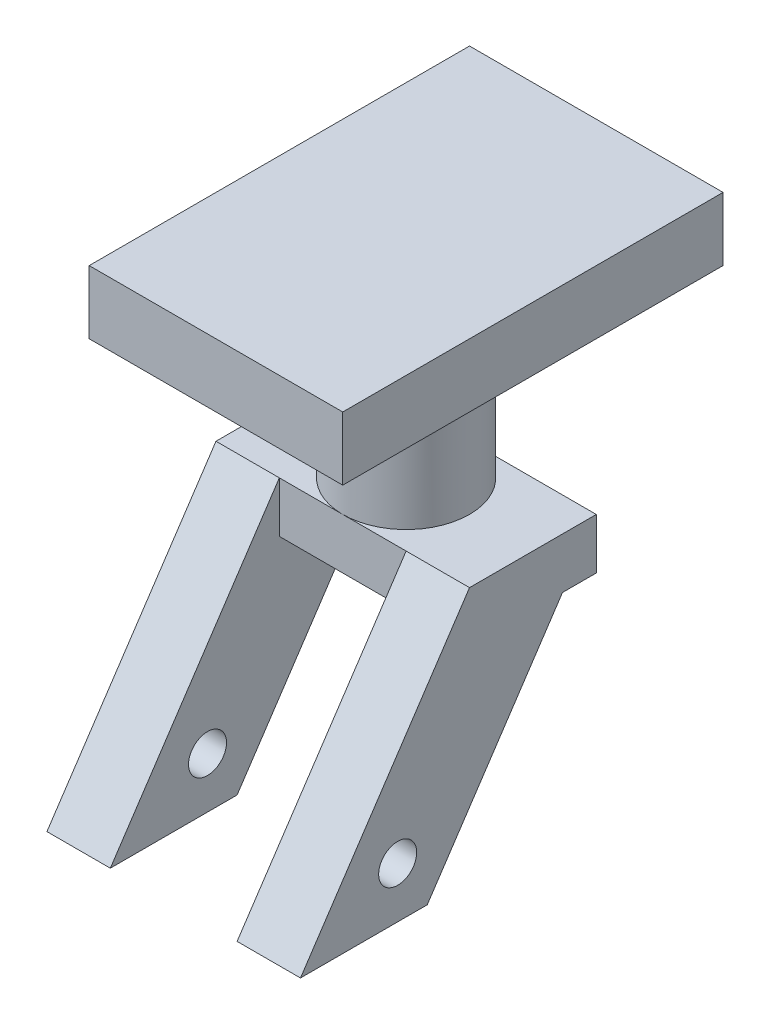
ISO-10303-21;
HEADER;
FILE_DESCRIPTION(('STEP AP214'),'2;1');
FILE_NAME('part.step','',(''),(''),'','','');
FILE_SCHEMA(('AUTOMOTIVE_DESIGN { 1 0 10303 214 1 1 1 1 }'));
ENDSEC;
DATA;
#1=APPLICATION_CONTEXT('core data for automotive mechanical design processes');
#2=APPLICATION_PROTOCOL_DEFINITION('international standard','automotive_design',2000,#1);
#3=PRODUCT_CONTEXT('',#1,'mechanical');
#4=PRODUCT('Part','Part','',(#3));
#5=PRODUCT_RELATED_PRODUCT_CATEGORY('part','',(#4));
#6=PRODUCT_DEFINITION_FORMATION('','',#4);
#7=PRODUCT_DEFINITION_CONTEXT('part definition',#1,'design');
#8=PRODUCT_DEFINITION('design','',#6,#7);
#9=PRODUCT_DEFINITION_SHAPE('','',#8);
#10=(LENGTH_UNIT() NAMED_UNIT(*) SI_UNIT(.MILLI.,.METRE.));
#11=(NAMED_UNIT(*) PLANE_ANGLE_UNIT() SI_UNIT($,.RADIAN.));
#12=(NAMED_UNIT(*) SI_UNIT($,.STERADIAN.) SOLID_ANGLE_UNIT());
#13=UNCERTAINTY_MEASURE_WITH_UNIT(LENGTH_MEASURE(1.E-05),#10,'distance_accuracy_value','');
#14=(GEOMETRIC_REPRESENTATION_CONTEXT(3) GLOBAL_UNCERTAINTY_ASSIGNED_CONTEXT((#13)) GLOBAL_UNIT_ASSIGNED_CONTEXT((#10,
#11,#12)) REPRESENTATION_CONTEXT('',''));
#15=CARTESIAN_POINT('',(0.,0.,0.));
#16=DIRECTION('',(0.,0.,1.));
#17=DIRECTION('',(1.,0.,0.));
#18=AXIS2_PLACEMENT_3D('',#15,#16,#17);
#19=CARTESIAN_POINT('',(-5.,-8.,2.5));
#20=DIRECTION('',(0.,0.,-1.));
#21=DIRECTION('',(-1.,0.,0.));
#22=AXIS2_PLACEMENT_3D('',#19,#20,#21);
#23=PLANE('',#22);
#24=DIRECTION('',(0.,-1.,0.));
#25=VECTOR('',#24,1.);
#26=CARTESIAN_POINT('',(2.5,-8.,2.5));
#27=LINE('',#26,#25);
#28=CARTESIAN_POINT('',(2.5,-6.,2.5));
#29=VERTEX_POINT('',#28);
#30=CARTESIAN_POINT('',(2.5,-8.,2.5));
#31=VERTEX_POINT('',#30);
#32=EDGE_CURVE('E60',#29,#31,#27,.T.);
#33=ORIENTED_EDGE('',*,*,#32,.F.);
#34=DIRECTION('',(-1.,0.,0.));
#35=VECTOR('',#34,1.);
#36=CARTESIAN_POINT('',(-5.,-6.,2.5));
#37=LINE('',#36,#35);
#38=CARTESIAN_POINT('',(0.,-6.,2.5));
#39=VERTEX_POINT('',#38);
#40=EDGE_CURVE('E260',#29,#39,#37,.T.);
#41=ORIENTED_EDGE('',*,*,#40,.T.);
#42=CARTESIAN_POINT('',(-2.5,-6.,2.5));
#43=VERTEX_POINT('',#42);
#44=EDGE_CURVE('E256',#39,#43,#37,.T.);
#45=ORIENTED_EDGE('',*,*,#44,.T.);
#46=DIRECTION('',(0.,1.,0.));
#47=VECTOR('',#46,1.);
#48=CARTESIAN_POINT('',(-2.5,-8.,2.5));
#49=LINE('',#48,#47);
#50=CARTESIAN_POINT('',(-2.5,-8.,2.5));
#51=VERTEX_POINT('',#50);
#52=EDGE_CURVE('E228',#51,#43,#49,.T.);
#53=ORIENTED_EDGE('',*,*,#52,.F.);
#54=DIRECTION('',(-1.,0.,0.));
#55=VECTOR('',#54,1.);
#56=CARTESIAN_POINT('',(-5.,-8.,2.5));
#57=LINE('',#56,#55);
#58=EDGE_CURVE('E242',#31,#51,#57,.T.);
#59=ORIENTED_EDGE('',*,*,#58,.F.);
#60=EDGE_LOOP('',(#33,#41,#45,#53,#59));
#61=FACE_BOUND('',#60,.T.);
#62=ADVANCED_FACE('F43',(#61),#23,.F.);
#63=CARTESIAN_POINT('',(5.,2.5,-7.5));
#64=DIRECTION('',(-1.,0.,0.));
#65=DIRECTION('',(0.,0.,1.));
#66=AXIS2_PLACEMENT_3D('',#63,#64,#65);
#67=PLANE('',#66);
#68=DIRECTION('',(0.,0.,-1.));
#69=VECTOR('',#68,1.);
#70=CARTESIAN_POINT('',(5.,0.,-7.5));
#71=LINE('',#70,#69);
#72=CARTESIAN_POINT('',(5.,0.,7.5));
#73=VERTEX_POINT('',#72);
#74=CARTESIAN_POINT('',(5.,0.,-7.5));
#75=VERTEX_POINT('',#74);
#76=EDGE_CURVE('E278',#73,#75,#71,.T.);
#77=ORIENTED_EDGE('',*,*,#76,.T.);
#78=DIRECTION('',(0.,-1.,0.));
#79=VECTOR('',#78,1.);
#80=CARTESIAN_POINT('',(5.,2.5,-7.5));
#81=LINE('',#80,#79);
#82=CARTESIAN_POINT('',(5.,2.5,-7.5));
#83=VERTEX_POINT('',#82);
#84=EDGE_CURVE('E284',#83,#75,#81,.T.);
#85=ORIENTED_EDGE('',*,*,#84,.F.);
#86=DIRECTION('',(0.,0.,-1.));
#87=VECTOR('',#86,1.);
#88=CARTESIAN_POINT('',(5.,2.5,-7.5));
#89=LINE('',#88,#87);
#90=CARTESIAN_POINT('',(5.,2.5,7.5));
#91=VERTEX_POINT('',#90);
#92=EDGE_CURVE('E285',#91,#83,#89,.T.);
#93=ORIENTED_EDGE('',*,*,#92,.F.);
#94=DIRECTION('',(0.,-1.,0.));
#95=VECTOR('',#94,1.);
#96=CARTESIAN_POINT('',(5.,2.5,7.5));
#97=LINE('',#96,#95);
#98=EDGE_CURVE('E299',#91,#73,#97,.T.);
#99=ORIENTED_EDGE('',*,*,#98,.T.);
#100=EDGE_LOOP('',(#77,#85,#93,#99));
#101=FACE_BOUND('',#100,.T.);
#102=ADVANCED_FACE('F45',(#101),#67,.F.);
#103=CARTESIAN_POINT('',(-5.,2.5,-7.5));
#104=DIRECTION('',(0.,0.,1.));
#105=DIRECTION('',(1.,0.,0.));
#106=AXIS2_PLACEMENT_3D('',#103,#104,#105);
#107=PLANE('',#106);
#108=DIRECTION('',(-1.,0.,0.));
#109=VECTOR('',#108,1.);
#110=CARTESIAN_POINT('',(-5.,0.,-7.5));
#111=LINE('',#110,#109);
#112=CARTESIAN_POINT('',(-5.,0.,-7.5));
#113=VERTEX_POINT('',#112);
#114=EDGE_CURVE('E303',#75,#113,#111,.T.);
#115=ORIENTED_EDGE('',*,*,#114,.T.);
#116=DIRECTION('',(0.,-1.,0.));
#117=VECTOR('',#116,1.);
#118=CARTESIAN_POINT('',(-5.,2.5,-7.5));
#119=LINE('',#118,#117);
#120=CARTESIAN_POINT('',(-5.,2.5,-7.5));
#121=VERTEX_POINT('',#120);
#122=EDGE_CURVE('E318',#121,#113,#119,.T.);
#123=ORIENTED_EDGE('',*,*,#122,.F.);
#124=DIRECTION('',(-1.,0.,0.));
#125=VECTOR('',#124,1.);
#126=CARTESIAN_POINT('',(-5.,2.5,-7.5));
#127=LINE('',#126,#125);
#128=EDGE_CURVE('E289',#83,#121,#127,.T.);
#129=ORIENTED_EDGE('',*,*,#128,.F.);
#130=ORIENTED_EDGE('',*,*,#84,.T.);
#131=EDGE_LOOP('',(#115,#123,#129,#130));
#132=FACE_BOUND('',#131,.T.);
#133=ADVANCED_FACE('F399',(#132),#107,.F.);
#134=CARTESIAN_POINT('',(-5.,2.5,-7.5));
#135=DIRECTION('',(1.,0.,0.));
#136=DIRECTION('',(0.,0.,-1.));
#137=AXIS2_PLACEMENT_3D('',#134,#135,#136);
#138=PLANE('',#137);
#139=DIRECTION('',(0.,0.,1.));
#140=VECTOR('',#139,1.);
#141=CARTESIAN_POINT('',(-5.,0.,-7.5));
#142=LINE('',#141,#140);
#143=CARTESIAN_POINT('',(-5.,0.,7.5));
#144=VERTEX_POINT('',#143);
#145=EDGE_CURVE('E306',#113,#144,#142,.T.);
#146=ORIENTED_EDGE('',*,*,#145,.T.);
#147=DIRECTION('',(0.,-1.,0.));
#148=VECTOR('',#147,1.);
#149=CARTESIAN_POINT('',(-5.,2.5,7.5));
#150=LINE('',#149,#148);
#151=CARTESIAN_POINT('',(-5.,2.5,7.5));
#152=VERTEX_POINT('',#151);
#153=EDGE_CURVE('E314',#152,#144,#150,.T.);
#154=ORIENTED_EDGE('',*,*,#153,.F.);
#155=DIRECTION('',(0.,0.,1.));
#156=VECTOR('',#155,1.);
#157=CARTESIAN_POINT('',(-5.,2.5,-7.5));
#158=LINE('',#157,#156);
#159=EDGE_CURVE('E293',#121,#152,#158,.T.);
#160=ORIENTED_EDGE('',*,*,#159,.F.);
#161=ORIENTED_EDGE('',*,*,#122,.T.);
#162=EDGE_LOOP('',(#146,#154,#160,#161));
#163=FACE_BOUND('',#162,.T.);
#164=ADVANCED_FACE('F423',(#163),#138,.F.);
#165=CARTESIAN_POINT('',(-5.,2.5,7.5));
#166=DIRECTION('',(0.,0.,-1.));
#167=DIRECTION('',(-1.,0.,0.));
#168=AXIS2_PLACEMENT_3D('',#165,#166,#167);
#169=PLANE('',#168);
#170=DIRECTION('',(1.,0.,0.));
#171=VECTOR('',#170,1.);
#172=CARTESIAN_POINT('',(-5.,0.,7.5));
#173=LINE('',#172,#171);
#174=EDGE_CURVE('E290',#144,#73,#173,.T.);
#175=ORIENTED_EDGE('',*,*,#174,.T.);
#176=ORIENTED_EDGE('',*,*,#98,.F.);
#177=DIRECTION('',(1.,0.,0.));
#178=VECTOR('',#177,1.);
#179=CARTESIAN_POINT('',(-5.,2.5,7.5));
#180=LINE('',#179,#178);
#181=EDGE_CURVE('E296',#152,#91,#180,.T.);
#182=ORIENTED_EDGE('',*,*,#181,.F.);
#183=ORIENTED_EDGE('',*,*,#153,.T.);
#184=EDGE_LOOP('',(#175,#176,#182,#183));
#185=FACE_BOUND('',#184,.T.);
#186=ADVANCED_FACE('F416',(#185),#169,.F.);
#187=CARTESIAN_POINT('',(0.,2.5,0.));
#188=DIRECTION('',(0.,1.,0.));
#189=DIRECTION('',(0.,0.,1.));
#190=AXIS2_PLACEMENT_3D('',#187,#188,#189);
#191=PLANE('',#190);
#192=ORIENTED_EDGE('',*,*,#92,.T.);
#193=ORIENTED_EDGE('',*,*,#128,.T.);
#194=ORIENTED_EDGE('',*,*,#159,.T.);
#195=ORIENTED_EDGE('',*,*,#181,.T.);
#196=EDGE_LOOP('',(#192,#193,#194,#195));
#197=FACE_BOUND('',#196,.T.);
#198=ADVANCED_FACE('F413',(#197),#191,.T.);
#199=CARTESIAN_POINT('',(0.,0.,0.));
#200=DIRECTION('',(0.,1.,0.));
#201=DIRECTION('',(0.,0.,1.));
#202=AXIS2_PLACEMENT_3D('',#199,#200,#201);
#203=PLANE('',#202);
#204=CARTESIAN_POINT('',(0.,0.,0.));
#205=DIRECTION('',(0.,-1.,0.));
#206=DIRECTION('',(0.,0.,-1.));
#207=AXIS2_PLACEMENT_3D('',#204,#205,#206);
#208=CIRCLE('',#207,2.5);
#209=CARTESIAN_POINT('',(0.,0.,-2.5));
#210=VERTEX_POINT('',#209);
#211=EDGE_CURVE('E279',#210,#210,#208,.T.);
#212=ORIENTED_EDGE('',*,*,#211,.F.);
#213=EDGE_LOOP('',(#212));
#214=FACE_BOUND('',#213,.T.);
#215=ORIENTED_EDGE('',*,*,#76,.F.);
#216=ORIENTED_EDGE('',*,*,#174,.F.);
#217=ORIENTED_EDGE('',*,*,#145,.F.);
#218=ORIENTED_EDGE('',*,*,#114,.F.);
#219=EDGE_LOOP('',(#215,#216,#217,#218));
#220=FACE_BOUND('',#219,.T.);
#221=ADVANCED_FACE('F411',(#214,#220),#203,.F.);
#222=CARTESIAN_POINT('',(0.,-6.,0.));
#223=DIRECTION('',(0.,1.,0.));
#224=DIRECTION('',(0.,0.,1.));
#225=AXIS2_PLACEMENT_3D('',#222,#223,#224);
#226=CYLINDRICAL_SURFACE('',#225,2.5);
#227=CARTESIAN_POINT('',(0.,-6.,0.));
#228=DIRECTION('',(0.,-1.,0.));
#229=DIRECTION('',(0.,0.,-1.));
#230=AXIS2_PLACEMENT_3D('',#227,#228,#229);
#231=CIRCLE('',#230,2.5);
#232=CARTESIAN_POINT('',(0.,-6.,-2.5));
#233=VERTEX_POINT('',#232);
#234=EDGE_CURVE('E275',#233,#39,#231,.T.);
#235=ORIENTED_EDGE('',*,*,#234,.F.);
#236=EDGE_CURVE('E274',#39,#233,#231,.T.);
#237=ORIENTED_EDGE('',*,*,#236,.F.);
#238=EDGE_LOOP('',(#235,#237));
#239=FACE_BOUND('',#238,.T.);
#240=ORIENTED_EDGE('',*,*,#211,.T.);
#241=EDGE_LOOP('',(#240));
#242=FACE_BOUND('',#241,.T.);
#243=ADVANCED_FACE('F407',(#239,#242),#226,.T.);
#244=CARTESIAN_POINT('',(0.,-6.,0.));
#245=DIRECTION('',(0.,-1.,0.));
#246=DIRECTION('',(0.,0.,-1.));
#247=AXIS2_PLACEMENT_3D('',#244,#245,#246);
#248=PLANE('',#247);
#249=DIRECTION('',(0.,0.,1.));
#250=VECTOR('',#249,1.);
#251=CARTESIAN_POINT('',(5.,-6.,2.5));
#252=LINE('',#251,#250);
#253=CARTESIAN_POINT('',(5.,-6.,-2.5));
#254=VERTEX_POINT('',#253);
#255=CARTESIAN_POINT('',(5.,-6.,2.5));
#256=VERTEX_POINT('',#255);
#257=EDGE_CURVE('E238',#254,#256,#252,.T.);
#258=ORIENTED_EDGE('',*,*,#257,.F.);
#259=DIRECTION('',(1.,0.,0.));
#260=VECTOR('',#259,1.);
#261=CARTESIAN_POINT('',(-5.,-6.,-2.5));
#262=LINE('',#261,#260);
#263=EDGE_CURVE('E263',#233,#254,#262,.T.);
#264=ORIENTED_EDGE('',*,*,#263,.F.);
#265=ORIENTED_EDGE('',*,*,#234,.T.);
#266=ORIENTED_EDGE('',*,*,#40,.F.);
#267=EDGE_CURVE('E175',#256,#29,#37,.T.);
#268=ORIENTED_EDGE('',*,*,#267,.F.);
#269=EDGE_LOOP('',(#258,#264,#265,#266,#268));
#270=FACE_BOUND('',#269,.T.);
#271=ADVANCED_FACE('F410',(#270),#248,.F.);
#272=DIRECTION('',(-1.,0.,0.));
#273=VECTOR('',#272,1.);
#274=CARTESIAN_POINT('',(-2.5,-6.,2.5));
#275=LINE('',#274,#273);
#276=CARTESIAN_POINT('',(-5.,-6.,2.5));
#277=VERTEX_POINT('',#276);
#278=EDGE_CURVE('E224',#43,#277,#275,.T.);
#279=ORIENTED_EDGE('',*,*,#278,.F.);
#280=ORIENTED_EDGE('',*,*,#44,.F.);
#281=ORIENTED_EDGE('',*,*,#236,.T.);
#282=CARTESIAN_POINT('',(-5.,-6.,-2.5));
#283=VERTEX_POINT('',#282);
#284=EDGE_CURVE('E243',#283,#233,#262,.T.);
#285=ORIENTED_EDGE('',*,*,#284,.F.);
#286=DIRECTION('',(0.,0.,-1.));
#287=VECTOR('',#286,1.);
#288=CARTESIAN_POINT('',(-5.,-6.,2.5));
#289=LINE('',#288,#287);
#290=EDGE_CURVE('E259',#277,#283,#289,.T.);
#291=ORIENTED_EDGE('',*,*,#290,.F.);
#292=EDGE_LOOP('',(#279,#280,#281,#285,#291));
#293=FACE_BOUND('',#292,.T.);
#294=ADVANCED_FACE('F406',(#293),#248,.F.);
#295=CARTESIAN_POINT('',(5.,-8.,2.5));
#296=DIRECTION('',(-1.,0.,0.));
#297=DIRECTION('',(0.,0.,1.));
#298=AXIS2_PLACEMENT_3D('',#295,#296,#297);
#299=PLANE('',#298);
#300=CARTESIAN_POINT('',(5.,-14.,5.33333333333334));
#301=DIRECTION('',(-1.,0.,0.));
#302=DIRECTION('',(0.,0.,1.));
#303=AXIS2_PLACEMENT_3D('',#300,#301,#302);
#304=CIRCLE('',#303,0.750000000000001);
#305=CARTESIAN_POINT('',(5.,-14.,6.08333333333334));
#306=VERTEX_POINT('',#305);
#307=EDGE_CURVE('E372',#306,#306,#304,.T.);
#308=ORIENTED_EDGE('',*,*,#307,.T.);
#309=EDGE_LOOP('',(#308));
#310=FACE_BOUND('',#309,.T.);
#311=ORIENTED_EDGE('',*,*,#257,.T.);
#312=DIRECTION('',(0.,-0.832050294337843,0.55470019622523));
#313=VECTOR('',#312,1.);
#314=CARTESIAN_POINT('',(5.,-6.,2.5));
#315=LINE('',#314,#313);
#316=CARTESIAN_POINT('',(5.,-16.,9.16666666666667));
#317=VERTEX_POINT('',#316);
#318=EDGE_CURVE('E191',#256,#317,#315,.T.);
#319=ORIENTED_EDGE('',*,*,#318,.T.);
#320=DIRECTION('',(0.,0.,-1.));
#321=VECTOR('',#320,1.);
#322=CARTESIAN_POINT('',(5.,-16.,9.16666666666667));
#323=LINE('',#322,#321);
#324=CARTESIAN_POINT('',(5.,-16.,4.16666666666667));
#325=VERTEX_POINT('',#324);
#326=EDGE_CURVE('E164',#317,#325,#323,.T.);
#327=ORIENTED_EDGE('',*,*,#326,.T.);
#328=DIRECTION('',(0.,0.832050294337843,-0.55470019622523));
#329=VECTOR('',#328,1.);
#330=CARTESIAN_POINT('',(5.,-16.,4.16666666666667));
#331=LINE('',#330,#329);
#332=CARTESIAN_POINT('',(5.,-8.,-1.16666666666666));
#333=VERTEX_POINT('',#332);
#334=EDGE_CURVE('E187',#325,#333,#331,.T.);
#335=ORIENTED_EDGE('',*,*,#334,.T.);
#336=DIRECTION('',(0.,0.,1.));
#337=VECTOR('',#336,1.);
#338=CARTESIAN_POINT('',(5.,-8.,2.5));
#339=LINE('',#338,#337);
#340=CARTESIAN_POINT('',(5.,-8.,-2.5));
#341=VERTEX_POINT('',#340);
#342=EDGE_CURVE('E239',#341,#333,#339,.T.);
#343=ORIENTED_EDGE('',*,*,#342,.F.);
#344=DIRECTION('',(0.,1.,0.));
#345=VECTOR('',#344,1.);
#346=CARTESIAN_POINT('',(5.,-8.,-2.5));
#347=LINE('',#346,#345);
#348=EDGE_CURVE('E252',#341,#254,#347,.T.);
#349=ORIENTED_EDGE('',*,*,#348,.T.);
#350=EDGE_LOOP('',(#311,#319,#327,#335,#343,#349));
#351=FACE_BOUND('',#350,.T.);
#352=ADVANCED_FACE('F359',(#310,#351),#299,.F.);
#353=CARTESIAN_POINT('',(-5.,-8.,2.5));
#354=DIRECTION('',(1.,0.,0.));
#355=DIRECTION('',(0.,0.,-1.));
#356=AXIS2_PLACEMENT_3D('',#353,#354,#355);
#357=PLANE('',#356);
#358=CARTESIAN_POINT('',(-5.,-14.,5.33333333333334));
#359=DIRECTION('',(-1.,0.,0.));
#360=DIRECTION('',(0.,0.,1.));
#361=AXIS2_PLACEMENT_3D('',#358,#359,#360);
#362=CIRCLE('',#361,0.750000000000001);
#363=CARTESIAN_POINT('',(-5.,-14.,6.08333333333334));
#364=VERTEX_POINT('',#363);
#365=EDGE_CURVE('E368',#364,#364,#362,.T.);
#366=ORIENTED_EDGE('',*,*,#365,.F.);
#367=EDGE_LOOP('',(#366));
#368=FACE_BOUND('',#367,.T.);
#369=DIRECTION('',(0.,0.832050294337843,-0.554700196225229));
#370=VECTOR('',#369,1.);
#371=CARTESIAN_POINT('',(-5.,-16.,9.16666666666667));
#372=LINE('',#371,#370);
#373=CARTESIAN_POINT('',(-5.,-16.,9.16666666666667));
#374=VERTEX_POINT('',#373);
#375=EDGE_CURVE('E206',#374,#277,#372,.T.);
#376=ORIENTED_EDGE('',*,*,#375,.T.);
#377=ORIENTED_EDGE('',*,*,#290,.T.);
#378=DIRECTION('',(0.,1.,0.));
#379=VECTOR('',#378,1.);
#380=CARTESIAN_POINT('',(-5.,-8.,-2.5));
#381=LINE('',#380,#379);
#382=CARTESIAN_POINT('',(-5.,-8.,-2.5));
#383=VERTEX_POINT('',#382);
#384=EDGE_CURVE('E270',#383,#283,#381,.T.);
#385=ORIENTED_EDGE('',*,*,#384,.F.);
#386=DIRECTION('',(0.,0.,-1.));
#387=VECTOR('',#386,1.);
#388=CARTESIAN_POINT('',(-5.,-8.,2.5));
#389=LINE('',#388,#387);
#390=CARTESIAN_POINT('',(-5.,-8.,-1.16666666666666));
#391=VERTEX_POINT('',#390);
#392=EDGE_CURVE('E246',#391,#383,#389,.T.);
#393=ORIENTED_EDGE('',*,*,#392,.F.);
#394=DIRECTION('',(0.,-0.832050294337843,0.554700196225229));
#395=VECTOR('',#394,1.);
#396=CARTESIAN_POINT('',(-5.,-6.,-2.5));
#397=LINE('',#396,#395);
#398=CARTESIAN_POINT('',(-5.,-16.,4.16666666666667));
#399=VERTEX_POINT('',#398);
#400=EDGE_CURVE('E201',#391,#399,#397,.T.);
#401=ORIENTED_EDGE('',*,*,#400,.T.);
#402=DIRECTION('',(0.,0.,1.));
#403=VECTOR('',#402,1.);
#404=CARTESIAN_POINT('',(-5.,-16.,4.16666666666667));
#405=LINE('',#404,#403);
#406=EDGE_CURVE('E217',#399,#374,#405,.T.);
#407=ORIENTED_EDGE('',*,*,#406,.T.);
#408=EDGE_LOOP('',(#376,#377,#385,#393,#401,#407));
#409=FACE_BOUND('',#408,.T.);
#410=ADVANCED_FACE('F349',(#368,#409),#357,.F.);
#411=CARTESIAN_POINT('',(-5.,-8.,-2.5));
#412=DIRECTION('',(0.,0.,1.));
#413=DIRECTION('',(1.,0.,0.));
#414=AXIS2_PLACEMENT_3D('',#411,#412,#413);
#415=PLANE('',#414);
#416=ORIENTED_EDGE('',*,*,#284,.T.);
#417=ORIENTED_EDGE('',*,*,#263,.T.);
#418=ORIENTED_EDGE('',*,*,#348,.F.);
#419=DIRECTION('',(1.,0.,0.));
#420=VECTOR('',#419,1.);
#421=CARTESIAN_POINT('',(-5.,-8.,-2.5));
#422=LINE('',#421,#420);
#423=EDGE_CURVE('E249',#383,#341,#422,.T.);
#424=ORIENTED_EDGE('',*,*,#423,.F.);
#425=ORIENTED_EDGE('',*,*,#384,.T.);
#426=EDGE_LOOP('',(#416,#417,#418,#424,#425));
#427=FACE_BOUND('',#426,.T.);
#428=ADVANCED_FACE('F355',(#427),#415,.F.);
#429=CARTESIAN_POINT('',(0.,-8.,0.));
#430=DIRECTION('',(0.,-1.,0.));
#431=DIRECTION('',(0.,0.,-1.));
#432=AXIS2_PLACEMENT_3D('',#429,#430,#431);
#433=PLANE('',#432);
#434=DIRECTION('',(1.,0.,0.));
#435=VECTOR('',#434,1.);
#436=CARTESIAN_POINT('',(0.,-8.,-1.16666666666667));
#437=LINE('',#436,#435);
#438=CARTESIAN_POINT('',(2.5,-8.,-1.16666666666666));
#439=VERTEX_POINT('',#438);
#440=EDGE_CURVE('E11',#439,#333,#437,.T.);
#441=ORIENTED_EDGE('',*,*,#440,.F.);
#442=DIRECTION('',(0.,0.,1.));
#443=VECTOR('',#442,1.);
#444=CARTESIAN_POINT('',(2.5,-8.,0.));
#445=LINE('',#444,#443);
#446=EDGE_CURVE('E53',#439,#31,#445,.T.);
#447=ORIENTED_EDGE('',*,*,#446,.T.);
#448=ORIENTED_EDGE('',*,*,#58,.T.);
#449=DIRECTION('',(0.,0.,-1.));
#450=VECTOR('',#449,1.);
#451=CARTESIAN_POINT('',(-2.5,-8.,0.));
#452=LINE('',#451,#450);
#453=CARTESIAN_POINT('',(-2.5,-8.,-1.16666666666666));
#454=VERTEX_POINT('',#453);
#455=EDGE_CURVE('E283',#51,#454,#452,.T.);
#456=ORIENTED_EDGE('',*,*,#455,.T.);
#457=DIRECTION('',(1.,0.,0.));
#458=VECTOR('',#457,1.);
#459=CARTESIAN_POINT('',(0.,-8.,-1.16666666666666));
#460=LINE('',#459,#458);
#461=EDGE_CURVE('E327',#391,#454,#460,.T.);
#462=ORIENTED_EDGE('',*,*,#461,.F.);
#463=ORIENTED_EDGE('',*,*,#392,.T.);
#464=ORIENTED_EDGE('',*,*,#423,.T.);
#465=ORIENTED_EDGE('',*,*,#342,.T.);
#466=EDGE_LOOP('',(#441,#447,#448,#456,#462,#463,#464,#465));
#467=FACE_BOUND('',#466,.T.);
#468=ADVANCED_FACE('F332',(#467),#433,.T.);
#469=CARTESIAN_POINT('',(-2.5,0.,0.));
#470=DIRECTION('',(-1.,0.,0.));
#471=DIRECTION('',(0.,0.,1.));
#472=AXIS2_PLACEMENT_3D('',#469,#470,#471);
#473=PLANE('',#472);
#474=CARTESIAN_POINT('',(-2.5,-14.,5.33333333333334));
#475=DIRECTION('',(-1.,0.,0.));
#476=DIRECTION('',(0.,0.,1.));
#477=AXIS2_PLACEMENT_3D('',#474,#475,#476);
#478=CIRCLE('',#477,0.750000000000001);
#479=CARTESIAN_POINT('',(-2.5,-14.,6.08333333333334));
#480=VERTEX_POINT('',#479);
#481=EDGE_CURVE('E192',#480,#480,#478,.T.);
#482=ORIENTED_EDGE('',*,*,#481,.T.);
#483=EDGE_LOOP('',(#482));
#484=FACE_BOUND('',#483,.T.);
#485=ORIENTED_EDGE('',*,*,#455,.F.);
#486=ORIENTED_EDGE('',*,*,#52,.T.);
#487=DIRECTION('',(0.,0.832050294337843,-0.554700196225229));
#488=VECTOR('',#487,1.);
#489=CARTESIAN_POINT('',(-2.5,-16.,9.16666666666667));
#490=LINE('',#489,#488);
#491=CARTESIAN_POINT('',(-2.5,-16.,9.16666666666667));
#492=VERTEX_POINT('',#491);
#493=EDGE_CURVE('E210',#492,#43,#490,.T.);
#494=ORIENTED_EDGE('',*,*,#493,.F.);
#495=DIRECTION('',(0.,0.,1.));
#496=VECTOR('',#495,1.);
#497=CARTESIAN_POINT('',(-2.5,-16.,4.16666666666667));
#498=LINE('',#497,#496);
#499=CARTESIAN_POINT('',(-2.5,-16.,4.16666666666667));
#500=VERTEX_POINT('',#499);
#501=EDGE_CURVE('E205',#500,#492,#498,.T.);
#502=ORIENTED_EDGE('',*,*,#501,.F.);
#503=DIRECTION('',(0.,-0.832050294337843,0.554700196225229));
#504=VECTOR('',#503,1.);
#505=CARTESIAN_POINT('',(-2.5,-6.,-2.5));
#506=LINE('',#505,#504);
#507=EDGE_CURVE('E202',#454,#500,#506,.T.);
#508=ORIENTED_EDGE('',*,*,#507,.F.);
#509=EDGE_LOOP('',(#485,#486,#494,#502,#508));
#510=FACE_BOUND('',#509,.T.);
#511=ADVANCED_FACE('F340',(#484,#510),#473,.F.);
#512=CARTESIAN_POINT('',(-2.5,-6.,-2.5));
#513=DIRECTION('',(0.,-0.554700196225229,-0.832050294337843));
#514=DIRECTION('',(0.,0.832050294337843,-0.554700196225229));
#515=AXIS2_PLACEMENT_3D('',#512,#513,#514);
#516=PLANE('',#515);
#517=ORIENTED_EDGE('',*,*,#400,.F.);
#518=ORIENTED_EDGE('',*,*,#461,.T.);
#519=ORIENTED_EDGE('',*,*,#507,.T.);
#520=DIRECTION('',(-1.,0.,0.));
#521=VECTOR('',#520,1.);
#522=CARTESIAN_POINT('',(-2.5,-16.,4.16666666666667));
#523=LINE('',#522,#521);
#524=EDGE_CURVE('E214',#500,#399,#523,.T.);
#525=ORIENTED_EDGE('',*,*,#524,.T.);
#526=EDGE_LOOP('',(#517,#518,#519,#525));
#527=FACE_BOUND('',#526,.T.);
#528=ADVANCED_FACE('F345',(#527),#516,.T.);
#529=CARTESIAN_POINT('',(-2.5,-16.,9.16666666666667));
#530=DIRECTION('',(0.,0.554700196225229,0.832050294337843));
#531=DIRECTION('',(0.,-0.832050294337843,0.554700196225229));
#532=AXIS2_PLACEMENT_3D('',#529,#530,#531);
#533=PLANE('',#532);
#534=ORIENTED_EDGE('',*,*,#375,.F.);
#535=DIRECTION('',(-1.,0.,0.));
#536=VECTOR('',#535,1.);
#537=CARTESIAN_POINT('',(-2.5,-16.,9.16666666666667));
#538=LINE('',#537,#536);
#539=EDGE_CURVE('E229',#492,#374,#538,.T.);
#540=ORIENTED_EDGE('',*,*,#539,.F.);
#541=ORIENTED_EDGE('',*,*,#493,.T.);
#542=ORIENTED_EDGE('',*,*,#278,.T.);
#543=EDGE_LOOP('',(#534,#540,#541,#542));
#544=FACE_BOUND('',#543,.T.);
#545=ADVANCED_FACE('F514',(#544),#533,.T.);
#546=CARTESIAN_POINT('',(-2.5,-16.,4.16666666666667));
#547=DIRECTION('',(0.,-1.,0.));
#548=DIRECTION('',(0.,0.,-1.));
#549=AXIS2_PLACEMENT_3D('',#546,#547,#548);
#550=PLANE('',#549);
#551=ORIENTED_EDGE('',*,*,#406,.F.);
#552=ORIENTED_EDGE('',*,*,#524,.F.);
#553=ORIENTED_EDGE('',*,*,#501,.T.);
#554=ORIENTED_EDGE('',*,*,#539,.T.);
#555=EDGE_LOOP('',(#551,#552,#553,#554));
#556=FACE_BOUND('',#555,.T.);
#557=ADVANCED_FACE('F521',(#556),#550,.T.);
#558=CARTESIAN_POINT('',(2.5,0.,0.));
#559=DIRECTION('',(1.,0.,0.));
#560=DIRECTION('',(0.,0.,-1.));
#561=AXIS2_PLACEMENT_3D('',#558,#559,#560);
#562=PLANE('',#561);
#563=CARTESIAN_POINT('',(2.5,-14.,5.33333333333334));
#564=DIRECTION('',(1.,0.,0.));
#565=DIRECTION('',(0.,0.,-1.));
#566=AXIS2_PLACEMENT_3D('',#563,#564,#565);
#567=CIRCLE('',#566,0.750000000000001);
#568=CARTESIAN_POINT('',(2.5,-14.,4.58333333333333));
#569=VERTEX_POINT('',#568);
#570=EDGE_CURVE('E47',#569,#569,#567,.T.);
#571=ORIENTED_EDGE('',*,*,#570,.T.);
#572=EDGE_LOOP('',(#571));
#573=FACE_BOUND('',#572,.T.);
#574=DIRECTION('',(0.,-0.832050294337843,0.55470019622523));
#575=VECTOR('',#574,1.);
#576=CARTESIAN_POINT('',(2.5,-6.,2.5));
#577=LINE('',#576,#575);
#578=CARTESIAN_POINT('',(2.5,-16.,9.16666666666667));
#579=VERTEX_POINT('',#578);
#580=EDGE_CURVE('E173',#29,#579,#577,.T.);
#581=ORIENTED_EDGE('',*,*,#580,.F.);
#582=ORIENTED_EDGE('',*,*,#32,.T.);
#583=ORIENTED_EDGE('',*,*,#446,.F.);
#584=DIRECTION('',(0.,0.832050294337843,-0.55470019622523));
#585=VECTOR('',#584,1.);
#586=CARTESIAN_POINT('',(2.5,-16.,4.16666666666667));
#587=LINE('',#586,#585);
#588=CARTESIAN_POINT('',(2.5,-16.,4.16666666666667));
#589=VERTEX_POINT('',#588);
#590=EDGE_CURVE('E178',#589,#439,#587,.T.);
#591=ORIENTED_EDGE('',*,*,#590,.F.);
#592=DIRECTION('',(0.,0.,-1.));
#593=VECTOR('',#592,1.);
#594=CARTESIAN_POINT('',(2.5,-16.,9.16666666666667));
#595=LINE('',#594,#593);
#596=EDGE_CURVE('E162',#579,#589,#595,.T.);
#597=ORIENTED_EDGE('',*,*,#596,.F.);
#598=EDGE_LOOP('',(#581,#582,#583,#591,#597));
#599=FACE_BOUND('',#598,.T.);
#600=ADVANCED_FACE('F181',(#573,#599),#562,.F.);
#601=CARTESIAN_POINT('',(2.5,-16.,4.16666666666667));
#602=DIRECTION('',(0.,-0.55470019622523,-0.832050294337843));
#603=DIRECTION('',(0.,0.832050294337843,-0.55470019622523));
#604=AXIS2_PLACEMENT_3D('',#601,#602,#603);
#605=PLANE('',#604);
#606=ORIENTED_EDGE('',*,*,#590,.T.);
#607=ORIENTED_EDGE('',*,*,#440,.T.);
#608=ORIENTED_EDGE('',*,*,#334,.F.);
#609=DIRECTION('',(1.,0.,0.));
#610=VECTOR('',#609,1.);
#611=CARTESIAN_POINT('',(2.5,-16.,4.16666666666667));
#612=LINE('',#611,#610);
#613=EDGE_CURVE('E169',#589,#325,#612,.T.);
#614=ORIENTED_EDGE('',*,*,#613,.F.);
#615=EDGE_LOOP('',(#606,#607,#608,#614));
#616=FACE_BOUND('',#615,.T.);
#617=ADVANCED_FACE('F362',(#616),#605,.T.);
#618=CARTESIAN_POINT('',(2.5,-16.,9.16666666666667));
#619=DIRECTION('',(0.,-1.,0.));
#620=DIRECTION('',(0.,0.,-1.));
#621=AXIS2_PLACEMENT_3D('',#618,#619,#620);
#622=PLANE('',#621);
#623=ORIENTED_EDGE('',*,*,#326,.F.);
#624=DIRECTION('',(1.,0.,0.));
#625=VECTOR('',#624,1.);
#626=CARTESIAN_POINT('',(2.5,-16.,9.16666666666667));
#627=LINE('',#626,#625);
#628=EDGE_CURVE('E158',#579,#317,#627,.T.);
#629=ORIENTED_EDGE('',*,*,#628,.F.);
#630=ORIENTED_EDGE('',*,*,#596,.T.);
#631=ORIENTED_EDGE('',*,*,#613,.T.);
#632=EDGE_LOOP('',(#623,#629,#630,#631));
#633=FACE_BOUND('',#632,.T.);
#634=ADVANCED_FACE('F160',(#633),#622,.T.);
#635=CARTESIAN_POINT('',(2.5,-6.,2.5));
#636=DIRECTION('',(0.,0.55470019622523,0.832050294337843));
#637=DIRECTION('',(0.,-0.832050294337843,0.55470019622523));
#638=AXIS2_PLACEMENT_3D('',#635,#636,#637);
#639=PLANE('',#638);
#640=ORIENTED_EDGE('',*,*,#318,.F.);
#641=ORIENTED_EDGE('',*,*,#267,.T.);
#642=ORIENTED_EDGE('',*,*,#580,.T.);
#643=ORIENTED_EDGE('',*,*,#628,.T.);
#644=EDGE_LOOP('',(#640,#641,#642,#643));
#645=FACE_BOUND('',#644,.T.);
#646=ADVANCED_FACE('F174',(#645),#639,.T.);
#647=CARTESIAN_POINT('',(5.,-14.,5.33333333333334));
#648=DIRECTION('',(-1.,0.,0.));
#649=DIRECTION('',(0.,0.,1.));
#650=AXIS2_PLACEMENT_3D('',#647,#648,#649);
#651=CYLINDRICAL_SURFACE('',#650,0.750000000000001);
#652=ORIENTED_EDGE('',*,*,#307,.F.);
#653=EDGE_LOOP('',(#652));
#654=FACE_BOUND('',#653,.T.);
#655=ORIENTED_EDGE('',*,*,#570,.F.);
#656=EDGE_LOOP('',(#655));
#657=FACE_BOUND('',#656,.T.);
#658=ADVANCED_FACE('F382',(#654,#657),#651,.F.);
#659=ORIENTED_EDGE('',*,*,#365,.T.);
#660=EDGE_LOOP('',(#659));
#661=FACE_BOUND('',#660,.T.);
#662=ORIENTED_EDGE('',*,*,#481,.F.);
#663=EDGE_LOOP('',(#662));
#664=FACE_BOUND('',#663,.T.);
#665=ADVANCED_FACE('F384',(#661,#664),#651,.F.);
#666=CLOSED_SHELL('',(#62,#102,#133,#164,#186,#198,#221,#243,#271,#294,#352,#410,#428,#468,#511,
#528,#545,#557,#600,#617,#634,#646,#658,#665));
#667=MANIFOLD_SOLID_BREP('B2',#666);
#668=ADVANCED_BREP_SHAPE_REPRESENTATION('',(#18,#667),#14);
#669=SHAPE_DEFINITION_REPRESENTATION(#9,#668);
ENDSEC;
END-ISO-10303-21;
